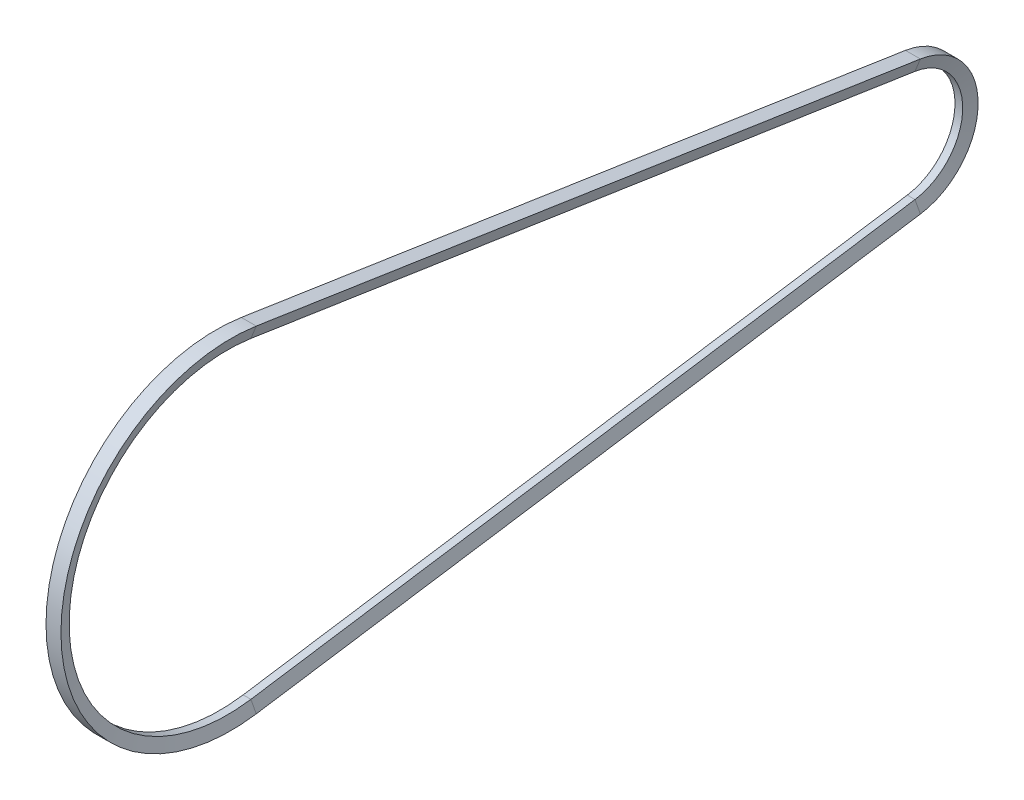
ISO-10303-21;
HEADER;
FILE_DESCRIPTION(('STEP AP214'),'2;1');
FILE_NAME('part.step','',(''),(''),'','','');
FILE_SCHEMA(('AUTOMOTIVE_DESIGN { 1 0 10303 214 1 1 1 1 }'));
ENDSEC;
DATA;
#1=APPLICATION_CONTEXT('core data for automotive mechanical design processes');
#2=APPLICATION_PROTOCOL_DEFINITION('international standard','automotive_design',2000,#1);
#3=PRODUCT_CONTEXT('',#1,'mechanical');
#4=PRODUCT('Part','Part','',(#3));
#5=PRODUCT_RELATED_PRODUCT_CATEGORY('part','',(#4));
#6=PRODUCT_DEFINITION_FORMATION('','',#4);
#7=PRODUCT_DEFINITION_CONTEXT('part definition',#1,'design');
#8=PRODUCT_DEFINITION('design','',#6,#7);
#9=PRODUCT_DEFINITION_SHAPE('','',#8);
#10=(LENGTH_UNIT() NAMED_UNIT(*) SI_UNIT(.MILLI.,.METRE.));
#11=(NAMED_UNIT(*) PLANE_ANGLE_UNIT() SI_UNIT($,.RADIAN.));
#12=(NAMED_UNIT(*) SI_UNIT($,.STERADIAN.) SOLID_ANGLE_UNIT());
#13=UNCERTAINTY_MEASURE_WITH_UNIT(LENGTH_MEASURE(1.E-05),#10,'distance_accuracy_value','');
#14=(GEOMETRIC_REPRESENTATION_CONTEXT(3) GLOBAL_UNCERTAINTY_ASSIGNED_CONTEXT((#13)) GLOBAL_UNIT_ASSIGNED_CONTEXT((#10,
#11,#12)) REPRESENTATION_CONTEXT('',''));
#15=CARTESIAN_POINT('',(0.,0.,0.));
#16=DIRECTION('',(0.,0.,1.));
#17=DIRECTION('',(1.,0.,0.));
#18=AXIS2_PLACEMENT_3D('',#15,#16,#17);
#19=CARTESIAN_POINT('',(2.84014307130969,40.8327316622341,-506.194999999998));
#20=DIRECTION('',(0.,-0.988685996664259,0.15));
#21=DIRECTION('',(0.,-0.15,-0.988685996664259));
#22=AXIS2_PLACEMENT_3D('',#19,#20,#21);
#23=PLANE('',#22);
#24=DIRECTION('',(1.,0.,0.));
#25=VECTOR('',#24,1.);
#26=CARTESIAN_POINT('',(2.84014307130969,40.8327316622341,-506.194999999998));
#27=LINE('',#26,#25);
#28=CARTESIAN_POINT('',(-2.84014307130969,40.8327316622341,-506.194999999998));
#29=VERTEX_POINT('',#28);
#30=CARTESIAN_POINT('',(2.84014307130969,40.8327316622341,-506.194999999998));
#31=VERTEX_POINT('',#30);
#32=EDGE_CURVE('E157',#29,#31,#27,.T.);
#33=ORIENTED_EDGE('',*,*,#32,.T.);
#34=DIRECTION('',(0.,0.15,0.988685996664259));
#35=VECTOR('',#34,1.);
#36=CARTESIAN_POINT('',(2.84014307130969,40.8327316622341,-506.194999999998));
#37=LINE('',#36,#35);
#38=CARTESIAN_POINT('',(2.84014307130969,114.984181412054,-17.4449999999985));
#39=VERTEX_POINT('',#38);
#40=EDGE_CURVE('E38',#31,#39,#37,.T.);
#41=ORIENTED_EDGE('',*,*,#40,.T.);
#42=DIRECTION('',(1.,0.,0.));
#43=VECTOR('',#42,1.);
#44=CARTESIAN_POINT('',(2.84014307130969,114.984181412054,-17.4449999999985));
#45=LINE('',#44,#43);
#46=CARTESIAN_POINT('',(-2.84014307130969,114.984181412054,-17.4449999999985));
#47=VERTEX_POINT('',#46);
#48=EDGE_CURVE('E178',#47,#39,#45,.T.);
#49=ORIENTED_EDGE('',*,*,#48,.F.);
#50=DIRECTION('',(0.,0.15,0.988685996664259));
#51=VECTOR('',#50,1.);
#52=CARTESIAN_POINT('',(-2.84014307130969,40.8327316622341,-506.194999999998));
#53=LINE('',#52,#51);
#54=EDGE_CURVE('E11',#29,#47,#53,.T.);
#55=ORIENTED_EDGE('',*,*,#54,.F.);
#56=EDGE_LOOP('',(#33,#41,#49,#55));
#57=FACE_BOUND('',#56,.T.);
#58=ADVANCED_FACE('F30',(#57),#23,.T.);
#59=CARTESIAN_POINT('',(5.5,49.4342998332132,-507.499999999998));
#60=DIRECTION('',(0.956304755963036,-0.289063810280224,0.04385575570841));
#61=DIRECTION('',(0.289342194072153,0.95722572820078,0.));
#62=AXIS2_PLACEMENT_3D('',#59,#60,#61);
#63=PLANE('',#62);
#64=DIRECTION('',(0.292371704722734,0.945485120764089,-0.143445713394439));
#65=VECTOR('',#64,1.);
#66=CARTESIAN_POINT('',(5.5,49.4342998332132,-507.499999999998));
#67=LINE('',#66,#65);
#68=CARTESIAN_POINT('',(5.5,49.4342998332132,-507.499999999998));
#69=VERTEX_POINT('',#68);
#70=EDGE_CURVE('E154',#31,#69,#67,.T.);
#71=ORIENTED_EDGE('',*,*,#70,.T.);
#72=DIRECTION('',(0.,0.15,0.988685996664259));
#73=VECTOR('',#72,1.);
#74=CARTESIAN_POINT('',(5.5,49.4342998332132,-507.499999999998));
#75=LINE('',#74,#73);
#76=CARTESIAN_POINT('',(5.5,123.585749583033,-18.7499999999983));
#77=VERTEX_POINT('',#76);
#78=EDGE_CURVE('E183',#69,#77,#75,.T.);
#79=ORIENTED_EDGE('',*,*,#78,.T.);
#80=DIRECTION('',(0.292371704722734,0.945485120764089,-0.143445713394439));
#81=VECTOR('',#80,1.);
#82=CARTESIAN_POINT('',(5.5,123.585749583033,-18.7499999999983));
#83=LINE('',#82,#81);
#84=EDGE_CURVE('E176',#39,#77,#83,.T.);
#85=ORIENTED_EDGE('',*,*,#84,.F.);
#86=ORIENTED_EDGE('',*,*,#40,.F.);
#87=EDGE_LOOP('',(#71,#79,#85,#86));
#88=FACE_BOUND('',#87,.T.);
#89=ADVANCED_FACE('F207',(#88),#63,.T.);
#90=CARTESIAN_POINT('',(-5.5,49.4342998332132,-507.499999999998));
#91=DIRECTION('',(0.,0.988685996664259,-0.15));
#92=DIRECTION('',(0.,0.15,0.988685996664259));
#93=AXIS2_PLACEMENT_3D('',#90,#91,#92);
#94=PLANE('',#93);
#95=DIRECTION('',(-1.,0.,0.));
#96=VECTOR('',#95,1.);
#97=CARTESIAN_POINT('',(-5.5,49.4342998332132,-507.499999999998));
#98=LINE('',#97,#96);
#99=CARTESIAN_POINT('',(-5.5,49.4342998332132,-507.499999999998));
#100=VERTEX_POINT('',#99);
#101=EDGE_CURVE('E151',#69,#100,#98,.T.);
#102=ORIENTED_EDGE('',*,*,#101,.T.);
#103=DIRECTION('',(0.,0.15,0.988685996664259));
#104=VECTOR('',#103,1.);
#105=CARTESIAN_POINT('',(-5.5,49.4342998332132,-507.499999999998));
#106=LINE('',#105,#104);
#107=CARTESIAN_POINT('',(-5.5,123.585749583033,-18.7499999999983));
#108=VERTEX_POINT('',#107);
#109=EDGE_CURVE('E180',#100,#108,#106,.T.);
#110=ORIENTED_EDGE('',*,*,#109,.T.);
#111=DIRECTION('',(-1.,0.,0.));
#112=VECTOR('',#111,1.);
#113=CARTESIAN_POINT('',(-5.5,123.585749583033,-18.7499999999983));
#114=LINE('',#113,#112);
#115=EDGE_CURVE('E173',#77,#108,#114,.T.);
#116=ORIENTED_EDGE('',*,*,#115,.F.);
#117=ORIENTED_EDGE('',*,*,#78,.F.);
#118=EDGE_LOOP('',(#102,#110,#116,#117));
#119=FACE_BOUND('',#118,.T.);
#120=ADVANCED_FACE('F206',(#119),#94,.T.);
#121=CARTESIAN_POINT('',(-2.84014307130969,40.8327316622341,-506.194999999998));
#122=DIRECTION('',(-0.956304755963036,-0.289063810280224,0.04385575570841));
#123=DIRECTION('',(0.289342194072153,-0.95722572820078,0.));
#124=AXIS2_PLACEMENT_3D('',#121,#122,#123);
#125=PLANE('',#124);
#126=DIRECTION('',(0.292371704722734,-0.945485120764089,0.143445713394439));
#127=VECTOR('',#126,1.);
#128=CARTESIAN_POINT('',(-2.84014307130969,40.8327316622341,-506.194999999998));
#129=LINE('',#128,#127);
#130=EDGE_CURVE('E109',#100,#29,#129,.T.);
#131=ORIENTED_EDGE('',*,*,#130,.T.);
#132=ORIENTED_EDGE('',*,*,#54,.T.);
#133=DIRECTION('',(0.292371704722734,-0.945485120764089,0.143445713394439));
#134=VECTOR('',#133,1.);
#135=CARTESIAN_POINT('',(-2.84014307130969,114.984181412054,-17.4449999999985));
#136=LINE('',#135,#134);
#137=EDGE_CURVE('E122',#108,#47,#136,.T.);
#138=ORIENTED_EDGE('',*,*,#137,.F.);
#139=ORIENTED_EDGE('',*,*,#109,.F.);
#140=EDGE_LOOP('',(#131,#132,#138,#139));
#141=FACE_BOUND('',#140,.T.);
#142=ADVANCED_FACE('F240',(#141),#125,.T.);
#143=CARTESIAN_POINT('',(0.,0.,-500.));
#144=DIRECTION('',(1.,0.,0.));
#145=DIRECTION('',(0.,0.,-1.));
#146=AXIS2_PLACEMENT_3D('',#143,#144,#145);
#147=CYLINDRICAL_SURFACE('',#146,41.2999999999999);
#148=DIRECTION('',(1.,0.,0.));
#149=VECTOR('',#148,1.);
#150=CARTESIAN_POINT('',(2.84014307130969,-40.8327316622336,-506.195000000002));
#151=LINE('',#150,#149);
#152=CARTESIAN_POINT('',(-2.84014307130969,-40.8327316622336,-506.195000000002));
#153=VERTEX_POINT('',#152);
#154=CARTESIAN_POINT('',(2.84014307130969,-40.8327316622336,-506.195000000002));
#155=VERTEX_POINT('',#154);
#156=EDGE_CURVE('E106',#153,#155,#151,.T.);
#157=ORIENTED_EDGE('',*,*,#156,.T.);
#158=CARTESIAN_POINT('',(2.84014307130969,0.,-500.));
#159=DIRECTION('',(1.,0.,0.));
#160=DIRECTION('',(0.,0.,-1.));
#161=AXIS2_PLACEMENT_3D('',#158,#159,#160);
#162=CIRCLE('',#161,41.2999999999999);
#163=EDGE_CURVE('E166',#155,#31,#162,.T.);
#164=ORIENTED_EDGE('',*,*,#163,.T.);
#165=ORIENTED_EDGE('',*,*,#32,.F.);
#166=CARTESIAN_POINT('',(-2.84014307130969,0.,-500.));
#167=DIRECTION('',(1.,0.,0.));
#168=DIRECTION('',(0.,0.,-1.));
#169=AXIS2_PLACEMENT_3D('',#166,#167,#168);
#170=CIRCLE('',#169,41.2999999999999);
#171=EDGE_CURVE('E169',#153,#29,#170,.T.);
#172=ORIENTED_EDGE('',*,*,#171,.F.);
#173=EDGE_LOOP('',(#157,#164,#165,#172));
#174=FACE_BOUND('',#173,.T.);
#175=ADVANCED_FACE('F237',(#174),#147,.F.);
#176=CARTESIAN_POINT('',(2.84014307130969,0.,-500.));
#177=DIRECTION('',(1.,0.,0.));
#178=DIRECTION('',(0.,0.,-1.));
#179=AXIS2_PLACEMENT_3D('',#176,#177,#178);
#180=CONICAL_SURFACE('',#179,41.2999999999999,1.27409035395586);
#181=DIRECTION('',(0.292371704722734,-0.945485120764084,-0.143445713394468));
#182=VECTOR('',#181,1.);
#183=CARTESIAN_POINT('',(5.5,-49.4342998332127,-507.500000000002));
#184=LINE('',#183,#182);
#185=CARTESIAN_POINT('',(5.5,-49.4342998332127,-507.500000000002));
#186=VERTEX_POINT('',#185);
#187=EDGE_CURVE('E140',#155,#186,#184,.T.);
#188=ORIENTED_EDGE('',*,*,#187,.T.);
#189=CARTESIAN_POINT('',(5.5,0.,-500.));
#190=DIRECTION('',(1.,0.,0.));
#191=DIRECTION('',(0.,0.,-1.));
#192=AXIS2_PLACEMENT_3D('',#189,#190,#191);
#193=CIRCLE('',#192,49.9999999999999);
#194=EDGE_CURVE('E163',#186,#69,#193,.T.);
#195=ORIENTED_EDGE('',*,*,#194,.T.);
#196=ORIENTED_EDGE('',*,*,#70,.F.);
#197=ORIENTED_EDGE('',*,*,#163,.F.);
#198=EDGE_LOOP('',(#188,#195,#196,#197));
#199=FACE_BOUND('',#198,.T.);
#200=ADVANCED_FACE('F214',(#199),#180,.F.);
#201=CARTESIAN_POINT('',(0.,0.,-500.));
#202=DIRECTION('',(1.,0.,0.));
#203=DIRECTION('',(0.,0.,-1.));
#204=AXIS2_PLACEMENT_3D('',#201,#202,#203);
#205=CYLINDRICAL_SURFACE('',#204,49.9999999999999);
#206=DIRECTION('',(-1.,0.,0.));
#207=VECTOR('',#206,1.);
#208=CARTESIAN_POINT('',(-5.5,-49.4342998332127,-507.500000000002));
#209=LINE('',#208,#207);
#210=CARTESIAN_POINT('',(-5.5,-49.4342998332127,-507.500000000002));
#211=VERTEX_POINT('',#210);
#212=EDGE_CURVE('E136',#186,#211,#209,.T.);
#213=ORIENTED_EDGE('',*,*,#212,.T.);
#214=CARTESIAN_POINT('',(-5.5,0.,-500.));
#215=DIRECTION('',(1.,0.,0.));
#216=DIRECTION('',(0.,0.,-1.));
#217=AXIS2_PLACEMENT_3D('',#214,#215,#216);
#218=CIRCLE('',#217,49.9999999999999);
#219=EDGE_CURVE('E160',#211,#100,#218,.T.);
#220=ORIENTED_EDGE('',*,*,#219,.T.);
#221=ORIENTED_EDGE('',*,*,#101,.F.);
#222=ORIENTED_EDGE('',*,*,#194,.F.);
#223=EDGE_LOOP('',(#213,#220,#221,#222));
#224=FACE_BOUND('',#223,.T.);
#225=ADVANCED_FACE('F212',(#224),#205,.T.);
#226=CARTESIAN_POINT('',(-5.5,0.,-500.));
#227=DIRECTION('',(-1.,0.,0.));
#228=DIRECTION('',(0.,0.,1.));
#229=AXIS2_PLACEMENT_3D('',#226,#227,#228);
#230=CONICAL_SURFACE('',#229,49.9999999999999,1.27409035395586);
#231=DIRECTION('',(0.292371704722734,0.945485120764084,0.143445713394468));
#232=VECTOR('',#231,1.);
#233=CARTESIAN_POINT('',(-2.84014307130969,-40.8327316622336,-506.195000000002));
#234=LINE('',#233,#232);
#235=EDGE_CURVE('E133',#211,#153,#234,.T.);
#236=ORIENTED_EDGE('',*,*,#235,.T.);
#237=ORIENTED_EDGE('',*,*,#171,.T.);
#238=ORIENTED_EDGE('',*,*,#130,.F.);
#239=ORIENTED_EDGE('',*,*,#219,.F.);
#240=EDGE_LOOP('',(#236,#237,#238,#239));
#241=FACE_BOUND('',#240,.T.);
#242=ADVANCED_FACE('F228',(#241),#230,.F.);
#243=CARTESIAN_POINT('',(2.84014307130969,-114.984181412053,-17.4450000000016));
#244=DIRECTION('',(0.,0.988685996664259,0.15));
#245=DIRECTION('',(0.,-0.15,0.988685996664259));
#246=AXIS2_PLACEMENT_3D('',#243,#244,#245);
#247=PLANE('',#246);
#248=DIRECTION('',(1.,0.,0.));
#249=VECTOR('',#248,1.);
#250=CARTESIAN_POINT('',(2.84014307130969,-114.984181412053,-17.4450000000016));
#251=LINE('',#250,#249);
#252=CARTESIAN_POINT('',(-2.84014307130969,-114.984181412053,-17.4450000000016));
#253=VERTEX_POINT('',#252);
#254=CARTESIAN_POINT('',(2.84014307130969,-114.984181412053,-17.4450000000016));
#255=VERTEX_POINT('',#254);
#256=EDGE_CURVE('E104',#253,#255,#251,.T.);
#257=ORIENTED_EDGE('',*,*,#256,.T.);
#258=DIRECTION('',(0.,0.15,-0.988685996664259));
#259=VECTOR('',#258,1.);
#260=CARTESIAN_POINT('',(2.84014307130969,-114.984181412053,-17.4450000000016));
#261=LINE('',#260,#259);
#262=EDGE_CURVE('E110',#255,#155,#261,.T.);
#263=ORIENTED_EDGE('',*,*,#262,.T.);
#264=ORIENTED_EDGE('',*,*,#156,.F.);
#265=DIRECTION('',(0.,0.15,-0.988685996664259));
#266=VECTOR('',#265,1.);
#267=CARTESIAN_POINT('',(-2.84014307130969,-114.984181412053,-17.4450000000016));
#268=LINE('',#267,#266);
#269=EDGE_CURVE('E100',#253,#153,#268,.T.);
#270=ORIENTED_EDGE('',*,*,#269,.F.);
#271=EDGE_LOOP('',(#257,#263,#264,#270));
#272=FACE_BOUND('',#271,.T.);
#273=ADVANCED_FACE('F102',(#272),#247,.T.);
#274=CARTESIAN_POINT('',(5.5,-123.585749583032,-18.7500000000017));
#275=DIRECTION('',(0.956304755963037,0.289063810280224,0.04385575570841));
#276=DIRECTION('',(-0.289342194072153,0.957225728200779,0.));
#277=AXIS2_PLACEMENT_3D('',#274,#275,#276);
#278=PLANE('',#277);
#279=DIRECTION('',(0.292371704722734,-0.945485120764084,-0.143445713394468));
#280=VECTOR('',#279,1.);
#281=CARTESIAN_POINT('',(5.5,-123.585749583032,-18.7500000000017));
#282=LINE('',#281,#280);
#283=CARTESIAN_POINT('',(5.5,-123.585749583032,-18.7500000000017));
#284=VERTEX_POINT('',#283);
#285=EDGE_CURVE('E127',#255,#284,#282,.T.);
#286=ORIENTED_EDGE('',*,*,#285,.T.);
#287=DIRECTION('',(0.,0.15,-0.988685996664259));
#288=VECTOR('',#287,1.);
#289=CARTESIAN_POINT('',(5.5,-123.585749583032,-18.7500000000017));
#290=LINE('',#289,#288);
#291=EDGE_CURVE('E145',#284,#186,#290,.T.);
#292=ORIENTED_EDGE('',*,*,#291,.T.);
#293=ORIENTED_EDGE('',*,*,#187,.F.);
#294=ORIENTED_EDGE('',*,*,#262,.F.);
#295=EDGE_LOOP('',(#286,#292,#293,#294));
#296=FACE_BOUND('',#295,.T.);
#297=ADVANCED_FACE('F220',(#296),#278,.T.);
#298=CARTESIAN_POINT('',(-5.5,-123.585749583032,-18.7500000000017));
#299=DIRECTION('',(0.,-0.988685996664259,-0.15));
#300=DIRECTION('',(0.,0.15,-0.988685996664259));
#301=AXIS2_PLACEMENT_3D('',#298,#299,#300);
#302=PLANE('',#301);
#303=DIRECTION('',(-1.,0.,0.));
#304=VECTOR('',#303,1.);
#305=CARTESIAN_POINT('',(-5.5,-123.585749583032,-18.7500000000017));
#306=LINE('',#305,#304);
#307=CARTESIAN_POINT('',(-5.5,-123.585749583032,-18.7500000000017));
#308=VERTEX_POINT('',#307);
#309=EDGE_CURVE('E124',#284,#308,#306,.T.);
#310=ORIENTED_EDGE('',*,*,#309,.T.);
#311=DIRECTION('',(0.,0.15,-0.988685996664259));
#312=VECTOR('',#311,1.);
#313=CARTESIAN_POINT('',(-5.5,-123.585749583032,-18.7500000000017));
#314=LINE('',#313,#312);
#315=EDGE_CURVE('E116',#308,#211,#314,.T.);
#316=ORIENTED_EDGE('',*,*,#315,.T.);
#317=ORIENTED_EDGE('',*,*,#212,.F.);
#318=ORIENTED_EDGE('',*,*,#291,.F.);
#319=EDGE_LOOP('',(#310,#316,#317,#318));
#320=FACE_BOUND('',#319,.T.);
#321=ADVANCED_FACE('F219',(#320),#302,.T.);
#322=CARTESIAN_POINT('',(-2.84014307130969,-114.984181412053,-17.4450000000016));
#323=DIRECTION('',(-0.956304755963037,0.289063810280224,0.04385575570841));
#324=DIRECTION('',(-0.289342194072153,-0.957225728200779,0.));
#325=AXIS2_PLACEMENT_3D('',#322,#323,#324);
#326=PLANE('',#325);
#327=DIRECTION('',(0.292371704722734,0.945485120764084,0.143445713394468));
#328=VECTOR('',#327,1.);
#329=CARTESIAN_POINT('',(-2.84014307130969,-114.984181412053,-17.4450000000016));
#330=LINE('',#329,#328);
#331=EDGE_CURVE('E113',#308,#253,#330,.T.);
#332=ORIENTED_EDGE('',*,*,#331,.T.);
#333=ORIENTED_EDGE('',*,*,#269,.T.);
#334=ORIENTED_EDGE('',*,*,#235,.F.);
#335=ORIENTED_EDGE('',*,*,#315,.F.);
#336=EDGE_LOOP('',(#332,#333,#334,#335));
#337=FACE_BOUND('',#336,.T.);
#338=ADVANCED_FACE('F114',(#337),#326,.T.);
#339=CARTESIAN_POINT('',(-5.5,0.,0.));
#340=DIRECTION('',(-1.,0.,0.));
#341=DIRECTION('',(0.,0.,1.));
#342=AXIS2_PLACEMENT_3D('',#339,#340,#341);
#343=CONICAL_SURFACE('',#342,125.,1.27409035395586);
#344=CARTESIAN_POINT('',(-5.5,0.,0.));
#345=DIRECTION('',(-1.,0.,0.));
#346=DIRECTION('',(0.,0.,1.));
#347=AXIS2_PLACEMENT_3D('',#344,#345,#346);
#348=CIRCLE('',#347,125.);
#349=EDGE_CURVE('E137',#308,#108,#348,.T.);
#350=ORIENTED_EDGE('',*,*,#349,.T.);
#351=ORIENTED_EDGE('',*,*,#137,.T.);
#352=CARTESIAN_POINT('',(-2.84014307130969,0.,0.));
#353=DIRECTION('',(-1.,0.,0.));
#354=DIRECTION('',(0.,0.,1.));
#355=AXIS2_PLACEMENT_3D('',#352,#353,#354);
#356=CIRCLE('',#355,116.3);
#357=EDGE_CURVE('E46',#253,#47,#356,.T.);
#358=ORIENTED_EDGE('',*,*,#357,.F.);
#359=ORIENTED_EDGE('',*,*,#331,.F.);
#360=EDGE_LOOP('',(#350,#351,#358,#359));
#361=FACE_BOUND('',#360,.T.);
#362=ADVANCED_FACE('F120',(#361),#343,.F.);
#363=CARTESIAN_POINT('',(0.,0.,0.));
#364=DIRECTION('',(-1.,0.,0.));
#365=DIRECTION('',(0.,0.,1.));
#366=AXIS2_PLACEMENT_3D('',#363,#364,#365);
#367=CYLINDRICAL_SURFACE('',#366,125.);
#368=CARTESIAN_POINT('',(5.5,0.,0.));
#369=DIRECTION('',(-1.,0.,0.));
#370=DIRECTION('',(0.,0.,1.));
#371=AXIS2_PLACEMENT_3D('',#368,#369,#370);
#372=CIRCLE('',#371,125.);
#373=EDGE_CURVE('E191',#284,#77,#372,.T.);
#374=ORIENTED_EDGE('',*,*,#373,.T.);
#375=ORIENTED_EDGE('',*,*,#115,.T.);
#376=ORIENTED_EDGE('',*,*,#349,.F.);
#377=ORIENTED_EDGE('',*,*,#309,.F.);
#378=EDGE_LOOP('',(#374,#375,#376,#377));
#379=FACE_BOUND('',#378,.T.);
#380=ADVANCED_FACE('F199',(#379),#367,.T.);
#381=CARTESIAN_POINT('',(2.84014307130969,0.,0.));
#382=DIRECTION('',(1.,0.,0.));
#383=DIRECTION('',(0.,0.,-1.));
#384=AXIS2_PLACEMENT_3D('',#381,#382,#383);
#385=CONICAL_SURFACE('',#384,116.3,1.27409035395586);
#386=CARTESIAN_POINT('',(2.84014307130969,0.,0.));
#387=DIRECTION('',(-1.,0.,0.));
#388=DIRECTION('',(0.,0.,1.));
#389=AXIS2_PLACEMENT_3D('',#386,#387,#388);
#390=CIRCLE('',#389,116.3);
#391=EDGE_CURVE('E54',#255,#39,#390,.T.);
#392=ORIENTED_EDGE('',*,*,#391,.T.);
#393=ORIENTED_EDGE('',*,*,#84,.T.);
#394=ORIENTED_EDGE('',*,*,#373,.F.);
#395=ORIENTED_EDGE('',*,*,#285,.F.);
#396=EDGE_LOOP('',(#392,#393,#394,#395));
#397=FACE_BOUND('',#396,.T.);
#398=ADVANCED_FACE('F203',(#397),#385,.F.);
#399=CARTESIAN_POINT('',(0.,0.,0.));
#400=DIRECTION('',(-1.,0.,0.));
#401=DIRECTION('',(0.,0.,1.));
#402=AXIS2_PLACEMENT_3D('',#399,#400,#401);
#403=CYLINDRICAL_SURFACE('',#402,116.3);
#404=ORIENTED_EDGE('',*,*,#256,.F.);
#405=ORIENTED_EDGE('',*,*,#357,.T.);
#406=ORIENTED_EDGE('',*,*,#48,.T.);
#407=ORIENTED_EDGE('',*,*,#391,.F.);
#408=EDGE_LOOP('',(#404,#405,#406,#407));
#409=FACE_BOUND('',#408,.T.);
#410=ADVANCED_FACE('F126',(#409),#403,.F.);
#411=CLOSED_SHELL('',(#58,#89,#120,#142,#175,#200,#225,#242,#273,#297,#321,#338,#362,#380,#398,#410));
#412=MANIFOLD_SOLID_BREP('B2',#411);
#413=ADVANCED_BREP_SHAPE_REPRESENTATION('',(#18,#412),#14);
#414=SHAPE_DEFINITION_REPRESENTATION(#9,#413);
ENDSEC;
END-ISO-10303-21;
